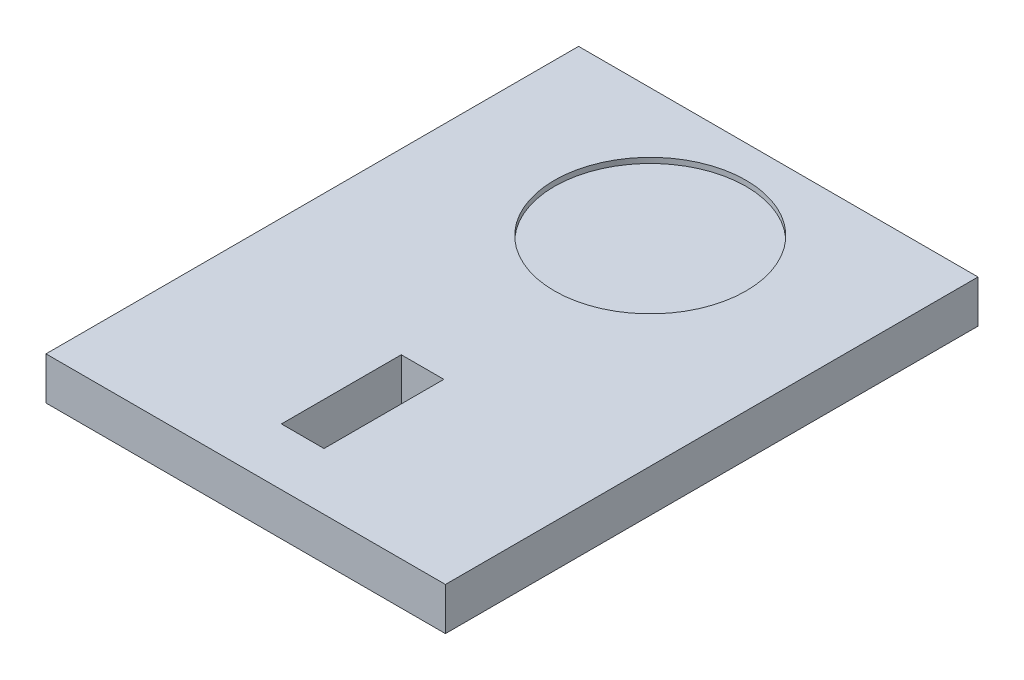
ISO-10303-21;
HEADER;
FILE_DESCRIPTION(('STEP AP214'),'2;1');
FILE_NAME('part.step','',(''),(''),'','','');
FILE_SCHEMA(('AUTOMOTIVE_DESIGN { 1 0 10303 214 1 1 1 1 }'));
ENDSEC;
DATA;
#1=APPLICATION_CONTEXT('core data for automotive mechanical design processes');
#2=APPLICATION_PROTOCOL_DEFINITION('international standard','automotive_design',2000,#1);
#3=PRODUCT_CONTEXT('',#1,'mechanical');
#4=PRODUCT('Part','Part','',(#3));
#5=PRODUCT_RELATED_PRODUCT_CATEGORY('part','',(#4));
#6=PRODUCT_DEFINITION_FORMATION('','',#4);
#7=PRODUCT_DEFINITION_CONTEXT('part definition',#1,'design');
#8=PRODUCT_DEFINITION('design','',#6,#7);
#9=PRODUCT_DEFINITION_SHAPE('','',#8);
#10=(LENGTH_UNIT() NAMED_UNIT(*) SI_UNIT(.MILLI.,.METRE.));
#11=(NAMED_UNIT(*) PLANE_ANGLE_UNIT() SI_UNIT($,.RADIAN.));
#12=(NAMED_UNIT(*) SI_UNIT($,.STERADIAN.) SOLID_ANGLE_UNIT());
#13=UNCERTAINTY_MEASURE_WITH_UNIT(LENGTH_MEASURE(1.E-05),#10,'distance_accuracy_value','');
#14=(GEOMETRIC_REPRESENTATION_CONTEXT(3) GLOBAL_UNCERTAINTY_ASSIGNED_CONTEXT((#13)) GLOBAL_UNIT_ASSIGNED_CONTEXT((#10,
#11,#12)) REPRESENTATION_CONTEXT('',''));
#15=CARTESIAN_POINT('',(0.,0.,0.));
#16=DIRECTION('',(0.,0.,1.));
#17=DIRECTION('',(1.,0.,0.));
#18=AXIS2_PLACEMENT_3D('',#15,#16,#17);
#19=CARTESIAN_POINT('',(17.0157068062828,16.,-182.460732984293));
#20=DIRECTION('',(-1.,0.,0.));
#21=DIRECTION('',(0.,0.,1.));
#22=AXIS2_PLACEMENT_3D('',#19,#20,#21);
#23=PLANE('',#22);
#24=DIRECTION('',(0.,0.,-1.));
#25=VECTOR('',#24,1.);
#26=CARTESIAN_POINT('',(17.0157068062828,0.,-182.460732984293));
#27=LINE('',#26,#25);
#28=CARTESIAN_POINT('',(17.0157068062828,0.,17.5392670157068));
#29=VERTEX_POINT('',#28);
#30=CARTESIAN_POINT('',(17.0157068062828,0.,-182.460732984293));
#31=VERTEX_POINT('',#30);
#32=EDGE_CURVE('E135',#29,#31,#27,.T.);
#33=ORIENTED_EDGE('',*,*,#32,.T.);
#34=DIRECTION('',(0.,-1.,0.));
#35=VECTOR('',#34,1.);
#36=CARTESIAN_POINT('',(17.0157068062828,16.,-182.460732984293));
#37=LINE('',#36,#35);
#38=CARTESIAN_POINT('',(17.0157068062828,16.,-182.460732984293));
#39=VERTEX_POINT('',#38);
#40=EDGE_CURVE('E177',#39,#31,#37,.T.);
#41=ORIENTED_EDGE('',*,*,#40,.F.);
#42=DIRECTION('',(0.,0.,-1.));
#43=VECTOR('',#42,1.);
#44=CARTESIAN_POINT('',(17.0157068062828,16.,-182.460732984293));
#45=LINE('',#44,#43);
#46=CARTESIAN_POINT('',(17.0157068062828,16.,17.5392670157068));
#47=VERTEX_POINT('',#46);
#48=EDGE_CURVE('E140',#47,#39,#45,.T.);
#49=ORIENTED_EDGE('',*,*,#48,.F.);
#50=DIRECTION('',(0.,-1.,0.));
#51=VECTOR('',#50,1.);
#52=CARTESIAN_POINT('',(17.0157068062828,16.,17.5392670157068));
#53=LINE('',#52,#51);
#54=EDGE_CURVE('E154',#47,#29,#53,.T.);
#55=ORIENTED_EDGE('',*,*,#54,.T.);
#56=EDGE_LOOP('',(#33,#41,#49,#55));
#57=FACE_BOUND('',#56,.T.);
#58=ADVANCED_FACE('F39',(#57),#23,.F.);
#59=CARTESIAN_POINT('',(-132.984293193717,16.,-182.460732984293));
#60=DIRECTION('',(0.,0.,1.));
#61=DIRECTION('',(1.,0.,0.));
#62=AXIS2_PLACEMENT_3D('',#59,#60,#61);
#63=PLANE('',#62);
#64=DIRECTION('',(-1.,0.,0.));
#65=VECTOR('',#64,1.);
#66=CARTESIAN_POINT('',(-132.984293193717,0.,-182.460732984293));
#67=LINE('',#66,#65);
#68=CARTESIAN_POINT('',(-132.984293193717,0.,-182.460732984293));
#69=VERTEX_POINT('',#68);
#70=EDGE_CURVE('E158',#31,#69,#67,.T.);
#71=ORIENTED_EDGE('',*,*,#70,.T.);
#72=DIRECTION('',(0.,-1.,0.));
#73=VECTOR('',#72,1.);
#74=CARTESIAN_POINT('',(-132.984293193717,16.,-182.460732984293));
#75=LINE('',#74,#73);
#76=CARTESIAN_POINT('',(-132.984293193717,16.,-182.460732984293));
#77=VERTEX_POINT('',#76);
#78=EDGE_CURVE('E173',#77,#69,#75,.T.);
#79=ORIENTED_EDGE('',*,*,#78,.F.);
#80=DIRECTION('',(-1.,0.,0.));
#81=VECTOR('',#80,1.);
#82=CARTESIAN_POINT('',(-132.984293193717,16.,-182.460732984293));
#83=LINE('',#82,#81);
#84=EDGE_CURVE('E144',#39,#77,#83,.T.);
#85=ORIENTED_EDGE('',*,*,#84,.F.);
#86=ORIENTED_EDGE('',*,*,#40,.T.);
#87=EDGE_LOOP('',(#71,#79,#85,#86));
#88=FACE_BOUND('',#87,.T.);
#89=ADVANCED_FACE('F205',(#88),#63,.F.);
#90=CARTESIAN_POINT('',(-132.984293193717,16.,-182.460732984293));
#91=DIRECTION('',(1.,0.,0.));
#92=DIRECTION('',(0.,0.,-1.));
#93=AXIS2_PLACEMENT_3D('',#90,#91,#92);
#94=PLANE('',#93);
#95=DIRECTION('',(0.,0.,1.));
#96=VECTOR('',#95,1.);
#97=CARTESIAN_POINT('',(-132.984293193717,0.,-182.460732984293));
#98=LINE('',#97,#96);
#99=CARTESIAN_POINT('',(-132.984293193717,0.,17.5392670157068));
#100=VERTEX_POINT('',#99);
#101=EDGE_CURVE('E161',#69,#100,#98,.T.);
#102=ORIENTED_EDGE('',*,*,#101,.T.);
#103=DIRECTION('',(0.,-1.,0.));
#104=VECTOR('',#103,1.);
#105=CARTESIAN_POINT('',(-132.984293193717,16.,17.5392670157068));
#106=LINE('',#105,#104);
#107=CARTESIAN_POINT('',(-132.984293193717,16.,17.5392670157068));
#108=VERTEX_POINT('',#107);
#109=EDGE_CURVE('E169',#108,#100,#106,.T.);
#110=ORIENTED_EDGE('',*,*,#109,.F.);
#111=DIRECTION('',(0.,0.,1.));
#112=VECTOR('',#111,1.);
#113=CARTESIAN_POINT('',(-132.984293193717,16.,-182.460732984293));
#114=LINE('',#113,#112);
#115=EDGE_CURVE('E148',#77,#108,#114,.T.);
#116=ORIENTED_EDGE('',*,*,#115,.F.);
#117=ORIENTED_EDGE('',*,*,#78,.T.);
#118=EDGE_LOOP('',(#102,#110,#116,#117));
#119=FACE_BOUND('',#118,.T.);
#120=ADVANCED_FACE('F210',(#119),#94,.F.);
#121=CARTESIAN_POINT('',(-132.984293193717,16.,17.5392670157068));
#122=DIRECTION('',(0.,0.,-1.));
#123=DIRECTION('',(-1.,0.,0.));
#124=AXIS2_PLACEMENT_3D('',#121,#122,#123);
#125=PLANE('',#124);
#126=DIRECTION('',(1.,0.,0.));
#127=VECTOR('',#126,1.);
#128=CARTESIAN_POINT('',(-132.984293193717,0.,17.5392670157068));
#129=LINE('',#128,#127);
#130=EDGE_CURVE('E145',#100,#29,#129,.T.);
#131=ORIENTED_EDGE('',*,*,#130,.T.);
#132=ORIENTED_EDGE('',*,*,#54,.F.);
#133=DIRECTION('',(1.,0.,0.));
#134=VECTOR('',#133,1.);
#135=CARTESIAN_POINT('',(-132.984293193717,16.,17.5392670157068));
#136=LINE('',#135,#134);
#137=EDGE_CURVE('E151',#108,#47,#136,.T.);
#138=ORIENTED_EDGE('',*,*,#137,.F.);
#139=ORIENTED_EDGE('',*,*,#109,.T.);
#140=EDGE_LOOP('',(#131,#132,#138,#139));
#141=FACE_BOUND('',#140,.T.);
#142=ADVANCED_FACE('F223',(#141),#125,.F.);
#143=CARTESIAN_POINT('',(0.,16.,0.));
#144=DIRECTION('',(0.,1.,0.));
#145=DIRECTION('',(0.,0.,1.));
#146=AXIS2_PLACEMENT_3D('',#143,#144,#145);
#147=PLANE('',#146);
#148=CARTESIAN_POINT('',(-57.9842931937172,16.,-134.377130506537));
#149=DIRECTION('',(0.,1.,0.));
#150=DIRECTION('',(0.,0.,1.));
#151=AXIS2_PLACEMENT_3D('',#148,#149,#150);
#152=CIRCLE('',#151,36.);
#153=CARTESIAN_POINT('',(-57.9842931937172,16.,-98.3771305065374));
#154=VERTEX_POINT('',#153);
#155=EDGE_CURVE('E237',#154,#154,#152,.T.);
#156=ORIENTED_EDGE('',*,*,#155,.F.);
#157=EDGE_LOOP('',(#156));
#158=FACE_BOUND('',#157,.T.);
#159=DIRECTION('',(0.,0.,-1.));
#160=VECTOR('',#159,1.);
#161=CARTESIAN_POINT('',(-49.9842931937172,16.,-48.8734116943527));
#162=LINE('',#161,#160);
#163=CARTESIAN_POINT('',(-49.9842931937172,16.,-3.87341169435268));
#164=VERTEX_POINT('',#163);
#165=CARTESIAN_POINT('',(-49.9842931937172,16.,-48.8734116943527));
#166=VERTEX_POINT('',#165);
#167=EDGE_CURVE('E54',#164,#166,#162,.T.);
#168=ORIENTED_EDGE('',*,*,#167,.F.);
#169=DIRECTION('',(1.,0.,0.));
#170=VECTOR('',#169,1.);
#171=CARTESIAN_POINT('',(-65.9842931937172,16.,-3.87341169435268));
#172=LINE('',#171,#170);
#173=CARTESIAN_POINT('',(-65.9842931937172,16.,-3.87341169435268));
#174=VERTEX_POINT('',#173);
#175=EDGE_CURVE('E125',#174,#164,#172,.T.);
#176=ORIENTED_EDGE('',*,*,#175,.F.);
#177=DIRECTION('',(0.,0.,1.));
#178=VECTOR('',#177,1.);
#179=CARTESIAN_POINT('',(-65.9842931937172,16.,-48.8734116943527));
#180=LINE('',#179,#178);
#181=CARTESIAN_POINT('',(-65.9842931937172,16.,-48.8734116943527));
#182=VERTEX_POINT('',#181);
#183=EDGE_CURVE('E107',#182,#174,#180,.T.);
#184=ORIENTED_EDGE('',*,*,#183,.F.);
#185=DIRECTION('',(-1.,0.,0.));
#186=VECTOR('',#185,1.);
#187=CARTESIAN_POINT('',(-65.9842931937172,16.,-48.8734116943527));
#188=LINE('',#187,#186);
#189=EDGE_CURVE('E117',#166,#182,#188,.T.);
#190=ORIENTED_EDGE('',*,*,#189,.F.);
#191=EDGE_LOOP('',(#168,#176,#184,#190));
#192=FACE_BOUND('',#191,.T.);
#193=ORIENTED_EDGE('',*,*,#48,.T.);
#194=ORIENTED_EDGE('',*,*,#84,.T.);
#195=ORIENTED_EDGE('',*,*,#115,.T.);
#196=ORIENTED_EDGE('',*,*,#137,.T.);
#197=EDGE_LOOP('',(#193,#194,#195,#196));
#198=FACE_BOUND('',#197,.T.);
#199=ADVANCED_FACE('F122',(#158,#192,#198),#147,.T.);
#200=CARTESIAN_POINT('',(0.,0.,0.));
#201=DIRECTION('',(0.,1.,0.));
#202=DIRECTION('',(0.,0.,1.));
#203=AXIS2_PLACEMENT_3D('',#200,#201,#202);
#204=PLANE('',#203);
#205=DIRECTION('',(1.,0.,0.));
#206=VECTOR('',#205,1.);
#207=CARTESIAN_POINT('',(0.,0.,-3.87341169435268));
#208=LINE('',#207,#206);
#209=CARTESIAN_POINT('',(-65.9842931937172,0.,-3.87341169435268));
#210=VERTEX_POINT('',#209);
#211=CARTESIAN_POINT('',(-49.9842931937172,0.,-3.87341169435268));
#212=VERTEX_POINT('',#211);
#213=EDGE_CURVE('E47',#210,#212,#208,.T.);
#214=ORIENTED_EDGE('',*,*,#213,.T.);
#215=DIRECTION('',(0.,0.,-1.));
#216=VECTOR('',#215,1.);
#217=CARTESIAN_POINT('',(-49.9842931937172,0.,0.));
#218=LINE('',#217,#216);
#219=CARTESIAN_POINT('',(-49.9842931937172,0.,-48.8734116943527));
#220=VERTEX_POINT('',#219);
#221=EDGE_CURVE('E11',#212,#220,#218,.T.);
#222=ORIENTED_EDGE('',*,*,#221,.T.);
#223=DIRECTION('',(-1.,0.,0.));
#224=VECTOR('',#223,1.);
#225=CARTESIAN_POINT('',(0.,0.,-48.8734116943527));
#226=LINE('',#225,#224);
#227=CARTESIAN_POINT('',(-65.9842931937172,0.,-48.8734116943527));
#228=VERTEX_POINT('',#227);
#229=EDGE_CURVE('E181',#220,#228,#226,.T.);
#230=ORIENTED_EDGE('',*,*,#229,.T.);
#231=DIRECTION('',(0.,0.,1.));
#232=VECTOR('',#231,1.);
#233=CARTESIAN_POINT('',(-65.9842931937172,0.,0.));
#234=LINE('',#233,#232);
#235=EDGE_CURVE('E110',#228,#210,#234,.T.);
#236=ORIENTED_EDGE('',*,*,#235,.T.);
#237=EDGE_LOOP('',(#214,#222,#230,#236));
#238=FACE_BOUND('',#237,.T.);
#239=ORIENTED_EDGE('',*,*,#32,.F.);
#240=ORIENTED_EDGE('',*,*,#130,.F.);
#241=ORIENTED_EDGE('',*,*,#101,.F.);
#242=ORIENTED_EDGE('',*,*,#70,.F.);
#243=EDGE_LOOP('',(#239,#240,#241,#242));
#244=FACE_BOUND('',#243,.T.);
#245=ADVANCED_FACE('F188',(#238,#244),#204,.F.);
#246=CARTESIAN_POINT('',(-49.9842931937172,-13.,-48.8734116943527));
#247=DIRECTION('',(1.,0.,0.));
#248=DIRECTION('',(0.,0.,-1.));
#249=AXIS2_PLACEMENT_3D('',#246,#247,#248);
#250=PLANE('',#249);
#251=DIRECTION('',(0.,1.,0.));
#252=VECTOR('',#251,1.);
#253=CARTESIAN_POINT('',(-49.9842931937172,-13.,-3.87341169435268));
#254=LINE('',#253,#252);
#255=EDGE_CURVE('E132',#212,#164,#254,.T.);
#256=ORIENTED_EDGE('',*,*,#255,.T.);
#257=ORIENTED_EDGE('',*,*,#167,.T.);
#258=DIRECTION('',(0.,1.,0.));
#259=VECTOR('',#258,1.);
#260=CARTESIAN_POINT('',(-49.9842931937172,-13.,-48.8734116943527));
#261=LINE('',#260,#259);
#262=EDGE_CURVE('E114',#220,#166,#261,.T.);
#263=ORIENTED_EDGE('',*,*,#262,.F.);
#264=ORIENTED_EDGE('',*,*,#221,.F.);
#265=EDGE_LOOP('',(#256,#257,#263,#264));
#266=FACE_BOUND('',#265,.T.);
#267=ADVANCED_FACE('F193',(#266),#250,.F.);
#268=CARTESIAN_POINT('',(-65.9842931937172,-13.,-3.87341169435268));
#269=DIRECTION('',(0.,0.,1.));
#270=DIRECTION('',(1.,0.,0.));
#271=AXIS2_PLACEMENT_3D('',#268,#269,#270);
#272=PLANE('',#271);
#273=DIRECTION('',(0.,1.,0.));
#274=VECTOR('',#273,1.);
#275=CARTESIAN_POINT('',(-65.9842931937172,-13.,-3.87341169435268));
#276=LINE('',#275,#274);
#277=EDGE_CURVE('E113',#210,#174,#276,.T.);
#278=ORIENTED_EDGE('',*,*,#277,.T.);
#279=ORIENTED_EDGE('',*,*,#175,.T.);
#280=ORIENTED_EDGE('',*,*,#255,.F.);
#281=ORIENTED_EDGE('',*,*,#213,.F.);
#282=EDGE_LOOP('',(#278,#279,#280,#281));
#283=FACE_BOUND('',#282,.T.);
#284=ADVANCED_FACE('F192',(#283),#272,.F.);
#285=CARTESIAN_POINT('',(-65.9842931937172,-13.,-48.8734116943527));
#286=DIRECTION('',(-1.,0.,0.));
#287=DIRECTION('',(0.,0.,1.));
#288=AXIS2_PLACEMENT_3D('',#285,#286,#287);
#289=PLANE('',#288);
#290=DIRECTION('',(0.,1.,0.));
#291=VECTOR('',#290,1.);
#292=CARTESIAN_POINT('',(-65.9842931937172,-13.,-48.8734116943527));
#293=LINE('',#292,#291);
#294=EDGE_CURVE('E62',#228,#182,#293,.T.);
#295=ORIENTED_EDGE('',*,*,#294,.T.);
#296=ORIENTED_EDGE('',*,*,#183,.T.);
#297=ORIENTED_EDGE('',*,*,#277,.F.);
#298=ORIENTED_EDGE('',*,*,#235,.F.);
#299=EDGE_LOOP('',(#295,#296,#297,#298));
#300=FACE_BOUND('',#299,.T.);
#301=ADVANCED_FACE('F104',(#300),#289,.F.);
#302=CARTESIAN_POINT('',(-65.9842931937172,-13.,-48.8734116943527));
#303=DIRECTION('',(0.,0.,-1.));
#304=DIRECTION('',(-1.,0.,0.));
#305=AXIS2_PLACEMENT_3D('',#302,#303,#304);
#306=PLANE('',#305);
#307=ORIENTED_EDGE('',*,*,#262,.T.);
#308=ORIENTED_EDGE('',*,*,#189,.T.);
#309=ORIENTED_EDGE('',*,*,#294,.F.);
#310=ORIENTED_EDGE('',*,*,#229,.F.);
#311=EDGE_LOOP('',(#307,#308,#309,#310));
#312=FACE_BOUND('',#311,.T.);
#313=ADVANCED_FACE('F118',(#312),#306,.F.);
#314=CARTESIAN_POINT('',(-57.9842931937172,14.,-134.377130506537));
#315=DIRECTION('',(0.,1.,0.));
#316=DIRECTION('',(0.,0.,1.));
#317=AXIS2_PLACEMENT_3D('',#314,#315,#316);
#318=CYLINDRICAL_SURFACE('',#317,36.);
#319=CARTESIAN_POINT('',(-57.9842931937172,14.,-134.377130506537));
#320=DIRECTION('',(0.,1.,0.));
#321=DIRECTION('',(0.,0.,1.));
#322=AXIS2_PLACEMENT_3D('',#319,#320,#321);
#323=CIRCLE('',#322,36.);
#324=CARTESIAN_POINT('',(-57.9842931937172,14.,-98.3771305065374));
#325=VERTEX_POINT('',#324);
#326=EDGE_CURVE('E240',#325,#325,#323,.T.);
#327=ORIENTED_EDGE('',*,*,#326,.F.);
#328=EDGE_LOOP('',(#327));
#329=FACE_BOUND('',#328,.T.);
#330=ORIENTED_EDGE('',*,*,#155,.T.);
#331=EDGE_LOOP('',(#330));
#332=FACE_BOUND('',#331,.T.);
#333=ADVANCED_FACE('F250',(#329,#332),#318,.F.);
#334=CARTESIAN_POINT('',(-57.9842931937172,14.,-134.377130506537));
#335=DIRECTION('',(0.,1.,0.));
#336=DIRECTION('',(0.,0.,1.));
#337=AXIS2_PLACEMENT_3D('',#334,#335,#336);
#338=PLANE('',#337);
#339=ORIENTED_EDGE('',*,*,#326,.T.);
#340=EDGE_LOOP('',(#339));
#341=FACE_BOUND('',#340,.T.);
#342=ADVANCED_FACE('F248',(#341),#338,.T.);
#343=CLOSED_SHELL('',(#58,#89,#120,#142,#199,#245,#267,#284,#301,#313,#333,#342));
#344=MANIFOLD_SOLID_BREP('B2',#343);
#345=ADVANCED_BREP_SHAPE_REPRESENTATION('',(#18,#344),#14);
#346=SHAPE_DEFINITION_REPRESENTATION(#9,#345);
ENDSEC;
END-ISO-10303-21;
